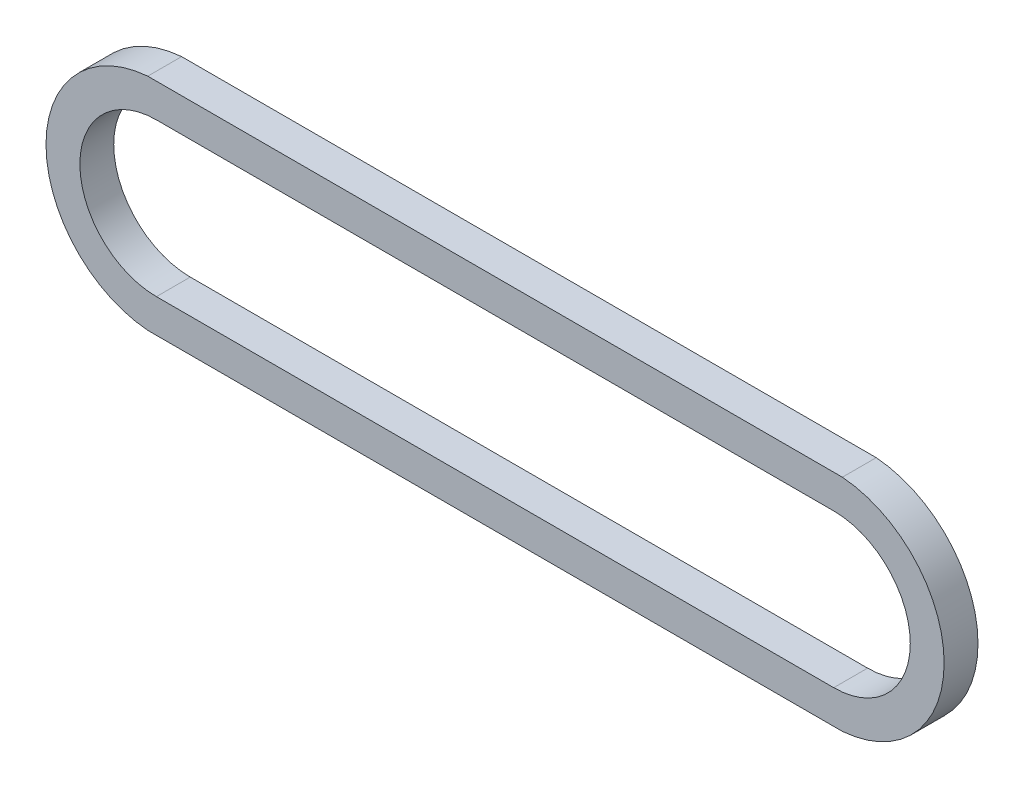
ISO-10303-21;
HEADER;
FILE_DESCRIPTION(('STEP AP214'),'2;1');
FILE_NAME('part.step','',(''),(''),'','','');
FILE_SCHEMA(('AUTOMOTIVE_DESIGN { 1 0 10303 214 1 1 1 1 }'));
ENDSEC;
DATA;
#1=APPLICATION_CONTEXT('core data for automotive mechanical design processes');
#2=APPLICATION_PROTOCOL_DEFINITION('international standard','automotive_design',2000,#1);
#3=PRODUCT_CONTEXT('',#1,'mechanical');
#4=PRODUCT('Part','Part','',(#3));
#5=PRODUCT_RELATED_PRODUCT_CATEGORY('part','',(#4));
#6=PRODUCT_DEFINITION_FORMATION('','',#4);
#7=PRODUCT_DEFINITION_CONTEXT('part definition',#1,'design');
#8=PRODUCT_DEFINITION('design','',#6,#7);
#9=PRODUCT_DEFINITION_SHAPE('','',#8);
#10=(LENGTH_UNIT() NAMED_UNIT(*) SI_UNIT(.MILLI.,.METRE.));
#11=(NAMED_UNIT(*) PLANE_ANGLE_UNIT() SI_UNIT($,.RADIAN.));
#12=(NAMED_UNIT(*) SI_UNIT($,.STERADIAN.) SOLID_ANGLE_UNIT());
#13=UNCERTAINTY_MEASURE_WITH_UNIT(LENGTH_MEASURE(1.E-05),#10,'distance_accuracy_value','');
#14=(GEOMETRIC_REPRESENTATION_CONTEXT(3) GLOBAL_UNCERTAINTY_ASSIGNED_CONTEXT((#13)) GLOBAL_UNIT_ASSIGNED_CONTEXT((#10,
#11,#12)) REPRESENTATION_CONTEXT('',''));
#15=CARTESIAN_POINT('',(0.,0.,0.));
#16=DIRECTION('',(0.,0.,1.));
#17=DIRECTION('',(1.,0.,0.));
#18=AXIS2_PLACEMENT_3D('',#15,#16,#17);
#19=CARTESIAN_POINT('',(0.,0.,6.35));
#20=DIRECTION('',(0.,0.,-1.));
#21=DIRECTION('',(-1.,0.,0.));
#22=AXIS2_PLACEMENT_3D('',#19,#20,#21);
#23=PLANE('',#22);
#24=CARTESIAN_POINT('',(-63.5,0.,6.35));
#25=DIRECTION('',(0.,0.,1.));
#26=DIRECTION('',(1.,0.,0.));
#27=AXIS2_PLACEMENT_3D('',#24,#25,#26);
#28=CIRCLE('',#27,20.701);
#29=CARTESIAN_POINT('',(-65.1201835544158,20.6375,6.35));
#30=VERTEX_POINT('',#29);
#31=CARTESIAN_POINT('',(-65.1201835544156,-20.6375,6.35));
#32=VERTEX_POINT('',#31);
#33=EDGE_CURVE('E109',#30,#32,#28,.T.);
#34=ORIENTED_EDGE('',*,*,#33,.T.);
#35=DIRECTION('',(1.,0.,0.));
#36=VECTOR('',#35,1.);
#37=CARTESIAN_POINT('',(84.201,-20.6375,6.35));
#38=LINE('',#37,#36);
#39=CARTESIAN_POINT('',(65.1201835544155,-20.6375,6.35));
#40=VERTEX_POINT('',#39);
#41=EDGE_CURVE('E42',#32,#40,#38,.T.);
#42=ORIENTED_EDGE('',*,*,#41,.T.);
#43=CARTESIAN_POINT('',(63.5,0.,6.35));
#44=DIRECTION('',(0.,0.,1.));
#45=DIRECTION('',(1.,0.,0.));
#46=AXIS2_PLACEMENT_3D('',#43,#44,#45);
#47=CIRCLE('',#46,20.701);
#48=CARTESIAN_POINT('',(65.120183554416,20.6375,6.35));
#49=VERTEX_POINT('',#48);
#50=EDGE_CURVE('E111',#49,#40,#47,.F.);
#51=ORIENTED_EDGE('',*,*,#50,.F.);
#52=DIRECTION('',(-1.,0.,0.));
#53=VECTOR('',#52,1.);
#54=CARTESIAN_POINT('',(84.201,20.6375,6.35));
#55=LINE('',#54,#53);
#56=EDGE_CURVE('E11',#49,#30,#55,.T.);
#57=ORIENTED_EDGE('',*,*,#56,.T.);
#58=EDGE_LOOP('',(#34,#42,#51,#57));
#59=FACE_BOUND('',#58,.T.);
#60=DIRECTION('',(-1.,0.,0.));
#61=VECTOR('',#60,1.);
#62=CARTESIAN_POINT('',(63.5,14.351,6.35));
#63=LINE('',#62,#61);
#64=CARTESIAN_POINT('',(63.5,14.351,6.35));
#65=VERTEX_POINT('',#64);
#66=CARTESIAN_POINT('',(-63.5,14.351,6.35));
#67=VERTEX_POINT('',#66);
#68=EDGE_CURVE('E136',#65,#67,#63,.T.);
#69=ORIENTED_EDGE('',*,*,#68,.F.);
#70=CARTESIAN_POINT('',(63.5,0.,6.35));
#71=DIRECTION('',(0.,0.,1.));
#72=DIRECTION('',(1.,0.,0.));
#73=AXIS2_PLACEMENT_3D('',#70,#71,#72);
#74=CIRCLE('',#73,14.351);
#75=CARTESIAN_POINT('',(63.5,-14.351,6.35));
#76=VERTEX_POINT('',#75);
#77=EDGE_CURVE('E139',#76,#65,#74,.T.);
#78=ORIENTED_EDGE('',*,*,#77,.F.);
#79=DIRECTION('',(1.,0.,0.));
#80=VECTOR('',#79,1.);
#81=CARTESIAN_POINT('',(63.5,-14.351,6.35));
#82=LINE('',#81,#80);
#83=CARTESIAN_POINT('',(-63.5,-14.351,6.35));
#84=VERTEX_POINT('',#83);
#85=EDGE_CURVE('E129',#84,#76,#82,.T.);
#86=ORIENTED_EDGE('',*,*,#85,.F.);
#87=CARTESIAN_POINT('',(-63.5,0.,6.35));
#88=DIRECTION('',(0.,0.,1.));
#89=DIRECTION('',(1.,0.,0.));
#90=AXIS2_PLACEMENT_3D('',#87,#88,#89);
#91=CIRCLE('',#90,14.351);
#92=EDGE_CURVE('E133',#67,#84,#91,.T.);
#93=ORIENTED_EDGE('',*,*,#92,.F.);
#94=EDGE_LOOP('',(#69,#78,#86,#93));
#95=FACE_BOUND('',#94,.T.);
#96=ADVANCED_FACE('F33',(#59,#95),#23,.F.);
#97=CARTESIAN_POINT('',(0.,0.,0.));
#98=DIRECTION('',(0.,0.,-1.));
#99=DIRECTION('',(-1.,0.,0.));
#100=AXIS2_PLACEMENT_3D('',#97,#98,#99);
#101=PLANE('',#100);
#102=CARTESIAN_POINT('',(63.5,0.,0.));
#103=DIRECTION('',(0.,0.,1.));
#104=DIRECTION('',(1.,0.,0.));
#105=AXIS2_PLACEMENT_3D('',#102,#103,#104);
#106=CIRCLE('',#105,14.351);
#107=CARTESIAN_POINT('',(63.5,-14.351,0.));
#108=VERTEX_POINT('',#107);
#109=CARTESIAN_POINT('',(63.5,14.351,0.));
#110=VERTEX_POINT('',#109);
#111=EDGE_CURVE('E132',#108,#110,#106,.T.);
#112=ORIENTED_EDGE('',*,*,#111,.T.);
#113=DIRECTION('',(-1.,0.,0.));
#114=VECTOR('',#113,1.);
#115=CARTESIAN_POINT('',(63.5,14.351,0.));
#116=LINE('',#115,#114);
#117=CARTESIAN_POINT('',(-63.5,14.351,0.));
#118=VERTEX_POINT('',#117);
#119=EDGE_CURVE('E146',#110,#118,#116,.T.);
#120=ORIENTED_EDGE('',*,*,#119,.T.);
#121=CARTESIAN_POINT('',(-63.5,0.,0.));
#122=DIRECTION('',(0.,0.,1.));
#123=DIRECTION('',(1.,0.,0.));
#124=AXIS2_PLACEMENT_3D('',#121,#122,#123);
#125=CIRCLE('',#124,14.351);
#126=CARTESIAN_POINT('',(-63.5,-14.351,0.));
#127=VERTEX_POINT('',#126);
#128=EDGE_CURVE('E143',#118,#127,#125,.T.);
#129=ORIENTED_EDGE('',*,*,#128,.T.);
#130=DIRECTION('',(1.,0.,0.));
#131=VECTOR('',#130,1.);
#132=CARTESIAN_POINT('',(63.5,-14.351,0.));
#133=LINE('',#132,#131);
#134=EDGE_CURVE('E126',#127,#108,#133,.T.);
#135=ORIENTED_EDGE('',*,*,#134,.T.);
#136=EDGE_LOOP('',(#112,#120,#129,#135));
#137=FACE_BOUND('',#136,.T.);
#138=DIRECTION('',(1.,0.,0.));
#139=VECTOR('',#138,1.);
#140=CARTESIAN_POINT('',(84.201,-20.6375,0.));
#141=LINE('',#140,#139);
#142=CARTESIAN_POINT('',(-65.1201835544156,-20.6375,0.));
#143=VERTEX_POINT('',#142);
#144=CARTESIAN_POINT('',(65.1201835544155,-20.6375,0.));
#145=VERTEX_POINT('',#144);
#146=EDGE_CURVE('E50',#143,#145,#141,.T.);
#147=ORIENTED_EDGE('',*,*,#146,.F.);
#148=CARTESIAN_POINT('',(-63.5,0.,0.));
#149=DIRECTION('',(0.,0.,1.));
#150=DIRECTION('',(1.,0.,0.));
#151=AXIS2_PLACEMENT_3D('',#148,#149,#150);
#152=CIRCLE('',#151,20.701);
#153=CARTESIAN_POINT('',(-65.1201835544158,20.6375,0.));
#154=VERTEX_POINT('',#153);
#155=EDGE_CURVE('E102',#154,#143,#152,.T.);
#156=ORIENTED_EDGE('',*,*,#155,.F.);
#157=DIRECTION('',(-1.,0.,0.));
#158=VECTOR('',#157,1.);
#159=CARTESIAN_POINT('',(84.201,20.6375,0.));
#160=LINE('',#159,#158);
#161=CARTESIAN_POINT('',(65.120183554416,20.6375,0.));
#162=VERTEX_POINT('',#161);
#163=EDGE_CURVE('E37',#162,#154,#160,.T.);
#164=ORIENTED_EDGE('',*,*,#163,.F.);
#165=CARTESIAN_POINT('',(63.5,0.,0.));
#166=DIRECTION('',(0.,0.,1.));
#167=DIRECTION('',(1.,0.,0.));
#168=AXIS2_PLACEMENT_3D('',#165,#166,#167);
#169=CIRCLE('',#168,20.701);
#170=EDGE_CURVE('E116',#162,#145,#169,.F.);
#171=ORIENTED_EDGE('',*,*,#170,.T.);
#172=EDGE_LOOP('',(#147,#156,#164,#171));
#173=FACE_BOUND('',#172,.T.);
#174=ADVANCED_FACE('F115',(#137,#173),#101,.T.);
#175=CARTESIAN_POINT('',(84.201,-20.6375,6.35));
#176=DIRECTION('',(0.,1.,0.));
#177=DIRECTION('',(-1.,0.,0.));
#178=AXIS2_PLACEMENT_3D('',#175,#176,#177);
#179=PLANE('',#178);
#180=DIRECTION('',(0.,0.,1.));
#181=VECTOR('',#180,1.);
#182=CARTESIAN_POINT('',(-65.1201835544156,-20.6375,0.));
#183=LINE('',#182,#181);
#184=EDGE_CURVE('E105',#143,#32,#183,.T.);
#185=ORIENTED_EDGE('',*,*,#184,.F.);
#186=ORIENTED_EDGE('',*,*,#146,.T.);
#187=DIRECTION('',(0.,0.,1.));
#188=VECTOR('',#187,1.);
#189=CARTESIAN_POINT('',(65.1201835544155,-20.6375,0.));
#190=LINE('',#189,#188);
#191=EDGE_CURVE('E151',#145,#40,#190,.T.);
#192=ORIENTED_EDGE('',*,*,#191,.T.);
#193=ORIENTED_EDGE('',*,*,#41,.F.);
#194=EDGE_LOOP('',(#185,#186,#192,#193));
#195=FACE_BOUND('',#194,.T.);
#196=ADVANCED_FACE('F35',(#195),#179,.F.);
#197=CARTESIAN_POINT('',(84.201,20.6375,6.35));
#198=DIRECTION('',(0.,-1.,0.));
#199=DIRECTION('',(1.,0.,0.));
#200=AXIS2_PLACEMENT_3D('',#197,#198,#199);
#201=PLANE('',#200);
#202=ORIENTED_EDGE('',*,*,#56,.F.);
#203=DIRECTION('',(0.,0.,1.));
#204=VECTOR('',#203,1.);
#205=CARTESIAN_POINT('',(65.120183554416,20.6375,0.));
#206=LINE('',#205,#204);
#207=EDGE_CURVE('E112',#162,#49,#206,.T.);
#208=ORIENTED_EDGE('',*,*,#207,.F.);
#209=ORIENTED_EDGE('',*,*,#163,.T.);
#210=DIRECTION('',(0.,0.,1.));
#211=VECTOR('',#210,1.);
#212=CARTESIAN_POINT('',(-65.1201835544158,20.6375,0.));
#213=LINE('',#212,#211);
#214=EDGE_CURVE('E107',#154,#30,#213,.T.);
#215=ORIENTED_EDGE('',*,*,#214,.T.);
#216=EDGE_LOOP('',(#202,#208,#209,#215));
#217=FACE_BOUND('',#216,.T.);
#218=ADVANCED_FACE('F162',(#217),#201,.F.);
#219=CARTESIAN_POINT('',(63.5,0.,0.));
#220=DIRECTION('',(0.,0.,1.));
#221=DIRECTION('',(1.,0.,0.));
#222=AXIS2_PLACEMENT_3D('',#219,#220,#221);
#223=CYLINDRICAL_SURFACE('',#222,14.351);
#224=ORIENTED_EDGE('',*,*,#77,.T.);
#225=DIRECTION('',(0.,0.,1.));
#226=VECTOR('',#225,1.);
#227=CARTESIAN_POINT('',(63.5,14.351,0.));
#228=LINE('',#227,#226);
#229=EDGE_CURVE('E122',#110,#65,#228,.T.);
#230=ORIENTED_EDGE('',*,*,#229,.F.);
#231=ORIENTED_EDGE('',*,*,#111,.F.);
#232=DIRECTION('',(0.,0.,1.));
#233=VECTOR('',#232,1.);
#234=CARTESIAN_POINT('',(63.5,-14.351,0.));
#235=LINE('',#234,#233);
#236=EDGE_CURVE('E117',#108,#76,#235,.T.);
#237=ORIENTED_EDGE('',*,*,#236,.T.);
#238=EDGE_LOOP('',(#224,#230,#231,#237));
#239=FACE_BOUND('',#238,.T.);
#240=ADVANCED_FACE('F177',(#239),#223,.F.);
#241=CARTESIAN_POINT('',(63.5,-14.351,0.));
#242=DIRECTION('',(0.,-1.,0.));
#243=DIRECTION('',(1.,0.,0.));
#244=AXIS2_PLACEMENT_3D('',#241,#242,#243);
#245=PLANE('',#244);
#246=ORIENTED_EDGE('',*,*,#85,.T.);
#247=ORIENTED_EDGE('',*,*,#236,.F.);
#248=ORIENTED_EDGE('',*,*,#134,.F.);
#249=DIRECTION('',(0.,0.,1.));
#250=VECTOR('',#249,1.);
#251=CARTESIAN_POINT('',(-63.5,-14.351,0.));
#252=LINE('',#251,#250);
#253=EDGE_CURVE('E118',#127,#84,#252,.T.);
#254=ORIENTED_EDGE('',*,*,#253,.T.);
#255=EDGE_LOOP('',(#246,#247,#248,#254));
#256=FACE_BOUND('',#255,.T.);
#257=ADVANCED_FACE('F180',(#256),#245,.F.);
#258=CARTESIAN_POINT('',(-63.5,0.,0.));
#259=DIRECTION('',(0.,0.,1.));
#260=DIRECTION('',(1.,0.,0.));
#261=AXIS2_PLACEMENT_3D('',#258,#259,#260);
#262=CYLINDRICAL_SURFACE('',#261,14.351);
#263=ORIENTED_EDGE('',*,*,#92,.T.);
#264=ORIENTED_EDGE('',*,*,#253,.F.);
#265=ORIENTED_EDGE('',*,*,#128,.F.);
#266=DIRECTION('',(0.,0.,1.));
#267=VECTOR('',#266,1.);
#268=CARTESIAN_POINT('',(-63.5,14.351,0.));
#269=LINE('',#268,#267);
#270=EDGE_CURVE('E125',#118,#67,#269,.T.);
#271=ORIENTED_EDGE('',*,*,#270,.T.);
#272=EDGE_LOOP('',(#263,#264,#265,#271));
#273=FACE_BOUND('',#272,.T.);
#274=ADVANCED_FACE('F182',(#273),#262,.F.);
#275=CARTESIAN_POINT('',(63.5,14.351,0.));
#276=DIRECTION('',(0.,1.,0.));
#277=DIRECTION('',(-1.,0.,0.));
#278=AXIS2_PLACEMENT_3D('',#275,#276,#277);
#279=PLANE('',#278);
#280=ORIENTED_EDGE('',*,*,#68,.T.);
#281=ORIENTED_EDGE('',*,*,#270,.F.);
#282=ORIENTED_EDGE('',*,*,#119,.F.);
#283=ORIENTED_EDGE('',*,*,#229,.T.);
#284=EDGE_LOOP('',(#280,#281,#282,#283));
#285=FACE_BOUND('',#284,.T.);
#286=ADVANCED_FACE('F173',(#285),#279,.F.);
#287=CARTESIAN_POINT('',(63.5,0.,0.));
#288=DIRECTION('',(0.,0.,1.));
#289=DIRECTION('',(1.,0.,0.));
#290=AXIS2_PLACEMENT_3D('',#287,#288,#289);
#291=CYLINDRICAL_SURFACE('',#290,20.701);
#292=ORIENTED_EDGE('',*,*,#50,.T.);
#293=ORIENTED_EDGE('',*,*,#191,.F.);
#294=ORIENTED_EDGE('',*,*,#170,.F.);
#295=ORIENTED_EDGE('',*,*,#207,.T.);
#296=EDGE_LOOP('',(#292,#293,#294,#295));
#297=FACE_BOUND('',#296,.T.);
#298=ADVANCED_FACE('F161',(#297),#291,.T.);
#299=CARTESIAN_POINT('',(-63.5,0.,0.));
#300=DIRECTION('',(0.,0.,1.));
#301=DIRECTION('',(1.,0.,0.));
#302=AXIS2_PLACEMENT_3D('',#299,#300,#301);
#303=CYLINDRICAL_SURFACE('',#302,20.701);
#304=ORIENTED_EDGE('',*,*,#33,.F.);
#305=ORIENTED_EDGE('',*,*,#214,.F.);
#306=ORIENTED_EDGE('',*,*,#155,.T.);
#307=ORIENTED_EDGE('',*,*,#184,.T.);
#308=EDGE_LOOP('',(#304,#305,#306,#307));
#309=FACE_BOUND('',#308,.T.);
#310=ADVANCED_FACE('F104',(#309),#303,.T.);
#311=CLOSED_SHELL('',(#96,#174,#196,#218,#240,#257,#274,#286,#298,#310));
#312=MANIFOLD_SOLID_BREP('B2',#311);
#313=ADVANCED_BREP_SHAPE_REPRESENTATION('',(#18,#312),#14);
#314=SHAPE_DEFINITION_REPRESENTATION(#9,#313);
ENDSEC;
END-ISO-10303-21;
